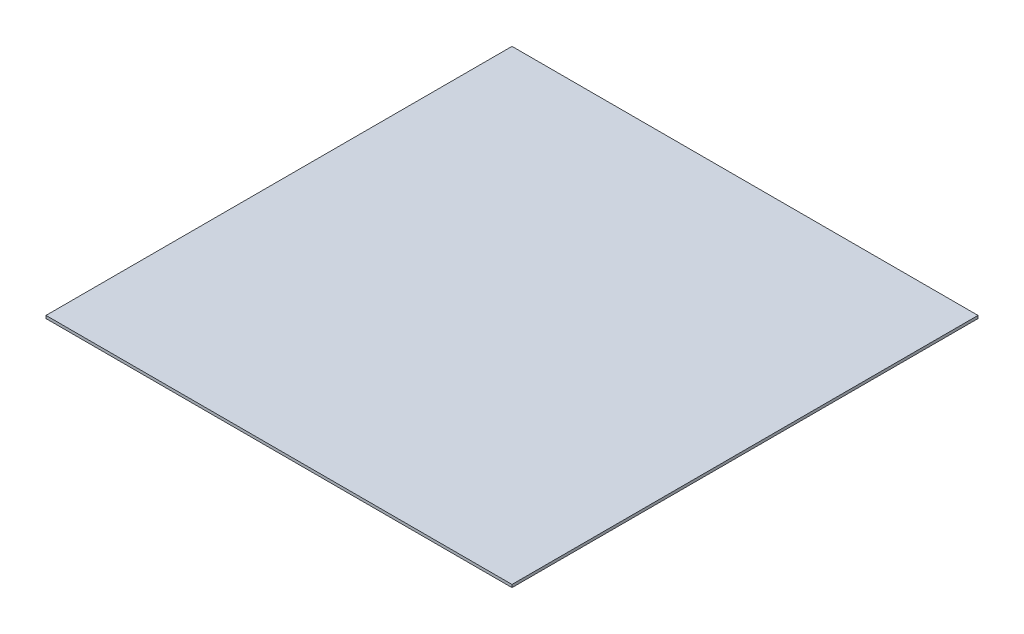
ISO-10303-21;
HEADER;
FILE_DESCRIPTION(('STEP AP214'),'2;1');
FILE_NAME('part.step','',(''),(''),'','','');
FILE_SCHEMA(('AUTOMOTIVE_DESIGN { 1 0 10303 214 1 1 1 1 }'));
ENDSEC;
DATA;
#1=APPLICATION_CONTEXT('core data for automotive mechanical design processes');
#2=APPLICATION_PROTOCOL_DEFINITION('international standard','automotive_design',2000,#1);
#3=PRODUCT_CONTEXT('',#1,'mechanical');
#4=PRODUCT('Part','Part','',(#3));
#5=PRODUCT_RELATED_PRODUCT_CATEGORY('part','',(#4));
#6=PRODUCT_DEFINITION_FORMATION('','',#4);
#7=PRODUCT_DEFINITION_CONTEXT('part definition',#1,'design');
#8=PRODUCT_DEFINITION('design','',#6,#7);
#9=PRODUCT_DEFINITION_SHAPE('','',#8);
#10=(LENGTH_UNIT() NAMED_UNIT(*) SI_UNIT(.MILLI.,.METRE.));
#11=(NAMED_UNIT(*) PLANE_ANGLE_UNIT() SI_UNIT($,.RADIAN.));
#12=(NAMED_UNIT(*) SI_UNIT($,.STERADIAN.) SOLID_ANGLE_UNIT());
#13=UNCERTAINTY_MEASURE_WITH_UNIT(LENGTH_MEASURE(1.E-05),#10,'distance_accuracy_value','');
#14=(GEOMETRIC_REPRESENTATION_CONTEXT(3) GLOBAL_UNCERTAINTY_ASSIGNED_CONTEXT((#13)) GLOBAL_UNIT_ASSIGNED_CONTEXT((#10,
#11,#12)) REPRESENTATION_CONTEXT('',''));
#15=CARTESIAN_POINT('',(0.,0.,0.));
#16=DIRECTION('',(0.,0.,1.));
#17=DIRECTION('',(1.,0.,0.));
#18=AXIS2_PLACEMENT_3D('',#15,#16,#17);
#19=CARTESIAN_POINT('',(250.,3.,250.));
#20=DIRECTION('',(-1.,0.,0.));
#21=DIRECTION('',(0.,0.,1.));
#22=AXIS2_PLACEMENT_3D('',#19,#20,#21);
#23=PLANE('',#22);
#24=DIRECTION('',(0.,0.,-1.));
#25=VECTOR('',#24,1.);
#26=CARTESIAN_POINT('',(250.,0.,250.));
#27=LINE('',#26,#25);
#28=CARTESIAN_POINT('',(250.,0.,250.));
#29=VERTEX_POINT('',#28);
#30=CARTESIAN_POINT('',(250.,0.,-250.));
#31=VERTEX_POINT('',#30);
#32=EDGE_CURVE('E102',#29,#31,#27,.T.);
#33=ORIENTED_EDGE('',*,*,#32,.T.);
#34=DIRECTION('',(0.,-1.,0.));
#35=VECTOR('',#34,1.);
#36=CARTESIAN_POINT('',(250.,3.,-250.));
#37=LINE('',#36,#35);
#38=CARTESIAN_POINT('',(250.,3.,-250.));
#39=VERTEX_POINT('',#38);
#40=EDGE_CURVE('E11',#39,#31,#37,.T.);
#41=ORIENTED_EDGE('',*,*,#40,.F.);
#42=DIRECTION('',(0.,0.,-1.));
#43=VECTOR('',#42,1.);
#44=CARTESIAN_POINT('',(250.,3.,250.));
#45=LINE('',#44,#43);
#46=CARTESIAN_POINT('',(250.,3.,250.));
#47=VERTEX_POINT('',#46);
#48=EDGE_CURVE('E90',#47,#39,#45,.T.);
#49=ORIENTED_EDGE('',*,*,#48,.F.);
#50=DIRECTION('',(0.,-1.,0.));
#51=VECTOR('',#50,1.);
#52=CARTESIAN_POINT('',(250.,3.,250.));
#53=LINE('',#52,#51);
#54=EDGE_CURVE('E98',#47,#29,#53,.T.);
#55=ORIENTED_EDGE('',*,*,#54,.T.);
#56=EDGE_LOOP('',(#33,#41,#49,#55));
#57=FACE_BOUND('',#56,.T.);
#58=ADVANCED_FACE('F39',(#57),#23,.F.);
#59=CARTESIAN_POINT('',(-250.,3.,-250.));
#60=DIRECTION('',(0.,0.,1.));
#61=DIRECTION('',(1.,0.,0.));
#62=AXIS2_PLACEMENT_3D('',#59,#60,#61);
#63=PLANE('',#62);
#64=DIRECTION('',(-1.,0.,0.));
#65=VECTOR('',#64,1.);
#66=CARTESIAN_POINT('',(-250.,0.,-250.));
#67=LINE('',#66,#65);
#68=CARTESIAN_POINT('',(-250.,0.,-250.));
#69=VERTEX_POINT('',#68);
#70=EDGE_CURVE('E94',#31,#69,#67,.T.);
#71=ORIENTED_EDGE('',*,*,#70,.T.);
#72=DIRECTION('',(0.,-1.,0.));
#73=VECTOR('',#72,1.);
#74=CARTESIAN_POINT('',(-250.,3.,-250.));
#75=LINE('',#74,#73);
#76=CARTESIAN_POINT('',(-250.,3.,-250.));
#77=VERTEX_POINT('',#76);
#78=EDGE_CURVE('E47',#77,#69,#75,.T.);
#79=ORIENTED_EDGE('',*,*,#78,.F.);
#80=DIRECTION('',(-1.,0.,0.));
#81=VECTOR('',#80,1.);
#82=CARTESIAN_POINT('',(-250.,3.,-250.));
#83=LINE('',#82,#81);
#84=EDGE_CURVE('E85',#39,#77,#83,.T.);
#85=ORIENTED_EDGE('',*,*,#84,.F.);
#86=ORIENTED_EDGE('',*,*,#40,.T.);
#87=EDGE_LOOP('',(#71,#79,#85,#86));
#88=FACE_BOUND('',#87,.T.);
#89=ADVANCED_FACE('F93',(#88),#63,.F.);
#90=CARTESIAN_POINT('',(-250.,3.,250.));
#91=DIRECTION('',(1.,0.,0.));
#92=DIRECTION('',(0.,0.,-1.));
#93=AXIS2_PLACEMENT_3D('',#90,#91,#92);
#94=PLANE('',#93);
#95=DIRECTION('',(0.,0.,1.));
#96=VECTOR('',#95,1.);
#97=CARTESIAN_POINT('',(-250.,0.,250.));
#98=LINE('',#97,#96);
#99=CARTESIAN_POINT('',(-250.,0.,250.));
#100=VERTEX_POINT('',#99);
#101=EDGE_CURVE('E72',#69,#100,#98,.T.);
#102=ORIENTED_EDGE('',*,*,#101,.T.);
#103=DIRECTION('',(0.,-1.,0.));
#104=VECTOR('',#103,1.);
#105=CARTESIAN_POINT('',(-250.,3.,250.));
#106=LINE('',#105,#104);
#107=CARTESIAN_POINT('',(-250.,3.,250.));
#108=VERTEX_POINT('',#107);
#109=EDGE_CURVE('E95',#108,#100,#106,.T.);
#110=ORIENTED_EDGE('',*,*,#109,.F.);
#111=DIRECTION('',(0.,0.,1.));
#112=VECTOR('',#111,1.);
#113=CARTESIAN_POINT('',(-250.,3.,250.));
#114=LINE('',#113,#112);
#115=EDGE_CURVE('E88',#77,#108,#114,.T.);
#116=ORIENTED_EDGE('',*,*,#115,.F.);
#117=ORIENTED_EDGE('',*,*,#78,.T.);
#118=EDGE_LOOP('',(#102,#110,#116,#117));
#119=FACE_BOUND('',#118,.T.);
#120=ADVANCED_FACE('F96',(#119),#94,.F.);
#121=CARTESIAN_POINT('',(-250.,3.,250.));
#122=DIRECTION('',(0.,0.,-1.));
#123=DIRECTION('',(-1.,0.,0.));
#124=AXIS2_PLACEMENT_3D('',#121,#122,#123);
#125=PLANE('',#124);
#126=DIRECTION('',(1.,0.,0.));
#127=VECTOR('',#126,1.);
#128=CARTESIAN_POINT('',(-250.,0.,250.));
#129=LINE('',#128,#127);
#130=EDGE_CURVE('E78',#100,#29,#129,.T.);
#131=ORIENTED_EDGE('',*,*,#130,.T.);
#132=ORIENTED_EDGE('',*,*,#54,.F.);
#133=DIRECTION('',(1.,0.,0.));
#134=VECTOR('',#133,1.);
#135=CARTESIAN_POINT('',(-250.,3.,250.));
#136=LINE('',#135,#134);
#137=EDGE_CURVE('E55',#108,#47,#136,.T.);
#138=ORIENTED_EDGE('',*,*,#137,.F.);
#139=ORIENTED_EDGE('',*,*,#109,.T.);
#140=EDGE_LOOP('',(#131,#132,#138,#139));
#141=FACE_BOUND('',#140,.T.);
#142=ADVANCED_FACE('F109',(#141),#125,.F.);
#143=CARTESIAN_POINT('',(0.,3.,0.));
#144=DIRECTION('',(0.,-1.,0.));
#145=DIRECTION('',(0.,0.,-1.));
#146=AXIS2_PLACEMENT_3D('',#143,#144,#145);
#147=PLANE('',#146);
#148=ORIENTED_EDGE('',*,*,#48,.T.);
#149=ORIENTED_EDGE('',*,*,#84,.T.);
#150=ORIENTED_EDGE('',*,*,#115,.T.);
#151=ORIENTED_EDGE('',*,*,#137,.T.);
#152=EDGE_LOOP('',(#148,#149,#150,#151));
#153=FACE_BOUND('',#152,.T.);
#154=ADVANCED_FACE('F86',(#153),#147,.F.);
#155=CARTESIAN_POINT('',(0.,0.,0.));
#156=DIRECTION('',(0.,-1.,0.));
#157=DIRECTION('',(0.,0.,-1.));
#158=AXIS2_PLACEMENT_3D('',#155,#156,#157);
#159=PLANE('',#158);
#160=ORIENTED_EDGE('',*,*,#32,.F.);
#161=ORIENTED_EDGE('',*,*,#130,.F.);
#162=ORIENTED_EDGE('',*,*,#101,.F.);
#163=ORIENTED_EDGE('',*,*,#70,.F.);
#164=EDGE_LOOP('',(#160,#161,#162,#163));
#165=FACE_BOUND('',#164,.T.);
#166=ADVANCED_FACE('F112',(#165),#159,.T.);
#167=CLOSED_SHELL('',(#58,#89,#120,#142,#154,#166));
#168=MANIFOLD_SOLID_BREP('B2',#167);
#169=ADVANCED_BREP_SHAPE_REPRESENTATION('',(#18,#168),#14);
#170=SHAPE_DEFINITION_REPRESENTATION(#9,#169);
ENDSEC;
END-ISO-10303-21;
